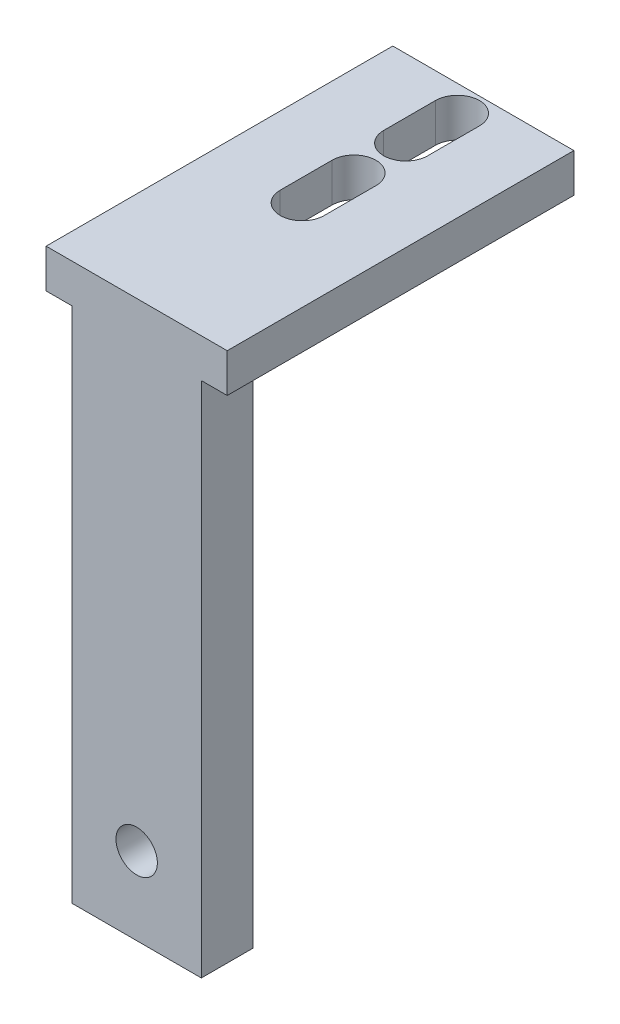
ISO-10303-21;
HEADER;
FILE_DESCRIPTION(('STEP AP214'),'2;1');
FILE_NAME('part.step','',(''),(''),'','','');
FILE_SCHEMA(('AUTOMOTIVE_DESIGN { 1 0 10303 214 1 1 1 1 }'));
ENDSEC;
DATA;
#1=APPLICATION_CONTEXT('core data for automotive mechanical design processes');
#2=APPLICATION_PROTOCOL_DEFINITION('international standard','automotive_design',2000,#1);
#3=PRODUCT_CONTEXT('',#1,'mechanical');
#4=PRODUCT('Part','Part','',(#3));
#5=PRODUCT_RELATED_PRODUCT_CATEGORY('part','',(#4));
#6=PRODUCT_DEFINITION_FORMATION('','',#4);
#7=PRODUCT_DEFINITION_CONTEXT('part definition',#1,'design');
#8=PRODUCT_DEFINITION('design','',#6,#7);
#9=PRODUCT_DEFINITION_SHAPE('','',#8);
#10=(LENGTH_UNIT() NAMED_UNIT(*) SI_UNIT(.MILLI.,.METRE.));
#11=(NAMED_UNIT(*) PLANE_ANGLE_UNIT() SI_UNIT($,.RADIAN.));
#12=(NAMED_UNIT(*) SI_UNIT($,.STERADIAN.) SOLID_ANGLE_UNIT());
#13=UNCERTAINTY_MEASURE_WITH_UNIT(LENGTH_MEASURE(1.E-05),#10,'distance_accuracy_value','');
#14=(GEOMETRIC_REPRESENTATION_CONTEXT(3) GLOBAL_UNCERTAINTY_ASSIGNED_CONTEXT((#13)) GLOBAL_UNIT_ASSIGNED_CONTEXT((#10,
#11,#12)) REPRESENTATION_CONTEXT('',''));
#15=CARTESIAN_POINT('',(0.,0.,0.));
#16=DIRECTION('',(0.,0.,1.));
#17=DIRECTION('',(1.,0.,0.));
#18=AXIS2_PLACEMENT_3D('',#15,#16,#17);
#19=CARTESIAN_POINT('',(0.,40.,47.8));
#20=DIRECTION('',(0.,0.,1.));
#21=DIRECTION('',(1.,0.,0.));
#22=AXIS2_PLACEMENT_3D('',#19,#20,#21);
#23=CYLINDRICAL_SURFACE('',#22,1.6);
#24=CARTESIAN_POINT('',(0.,40.,57.8));
#25=DIRECTION('',(0.,0.,1.));
#26=DIRECTION('',(1.,0.,0.));
#27=AXIS2_PLACEMENT_3D('',#24,#25,#26);
#28=CIRCLE('',#27,1.6);
#29=CARTESIAN_POINT('',(1.6,40.,57.8));
#30=VERTEX_POINT('',#29);
#31=EDGE_CURVE('E218',#30,#30,#28,.T.);
#32=ORIENTED_EDGE('',*,*,#31,.T.);
#33=EDGE_LOOP('',(#32));
#34=FACE_BOUND('',#33,.T.);
#35=CARTESIAN_POINT('',(0.,40.,53.8));
#36=DIRECTION('',(0.,0.,1.));
#37=DIRECTION('',(1.,0.,0.));
#38=AXIS2_PLACEMENT_3D('',#35,#36,#37);
#39=CIRCLE('',#38,1.6);
#40=CARTESIAN_POINT('',(1.6,40.,53.8));
#41=VERTEX_POINT('',#40);
#42=EDGE_CURVE('E334',#41,#41,#39,.T.);
#43=ORIENTED_EDGE('',*,*,#42,.F.);
#44=EDGE_LOOP('',(#43));
#45=FACE_BOUND('',#44,.T.);
#46=ADVANCED_FACE('F17',(#34,#45),#23,.F.);
#47=CARTESIAN_POINT('',(-5.,34.,53.8));
#48=DIRECTION('',(0.,1.,0.));
#49=DIRECTION('',(1.,0.,0.));
#50=AXIS2_PLACEMENT_3D('',#47,#48,#49);
#51=PLANE('',#50);
#52=DIRECTION('',(0.,0.,1.));
#53=VECTOR('',#52,1.);
#54=CARTESIAN_POINT('',(5.,34.,53.8));
#55=LINE('',#54,#53);
#56=CARTESIAN_POINT('',(5.,34.,53.8));
#57=VERTEX_POINT('',#56);
#58=CARTESIAN_POINT('',(5.,34.,57.8));
#59=VERTEX_POINT('',#58);
#60=EDGE_CURVE('E224',#57,#59,#55,.T.);
#61=ORIENTED_EDGE('',*,*,#60,.T.);
#62=DIRECTION('',(1.,0.,0.));
#63=VECTOR('',#62,1.);
#64=CARTESIAN_POINT('',(-5.,34.,57.8));
#65=LINE('',#64,#63);
#66=CARTESIAN_POINT('',(-5.,34.,57.8));
#67=VERTEX_POINT('',#66);
#68=EDGE_CURVE('E227',#67,#59,#65,.T.);
#69=ORIENTED_EDGE('',*,*,#68,.F.);
#70=DIRECTION('',(0.,0.,1.));
#71=VECTOR('',#70,1.);
#72=CARTESIAN_POINT('',(-5.,34.,53.8));
#73=LINE('',#72,#71);
#74=CARTESIAN_POINT('',(-5.,34.,53.8));
#75=VERTEX_POINT('',#74);
#76=EDGE_CURVE('E37',#75,#67,#73,.T.);
#77=ORIENTED_EDGE('',*,*,#76,.F.);
#78=DIRECTION('',(1.,0.,0.));
#79=VECTOR('',#78,1.);
#80=CARTESIAN_POINT('',(-5.,34.,53.8));
#81=LINE('',#80,#79);
#82=EDGE_CURVE('E44',#75,#57,#81,.T.);
#83=ORIENTED_EDGE('',*,*,#82,.T.);
#84=EDGE_LOOP('',(#61,#69,#77,#83));
#85=FACE_BOUND('',#84,.T.);
#86=ADVANCED_FACE('F391',(#85),#51,.F.);
#87=CARTESIAN_POINT('',(1.7,71.5,41.));
#88=DIRECTION('',(1.,0.,0.));
#89=DIRECTION('',(0.,1.,0.));
#90=AXIS2_PLACEMENT_3D('',#87,#88,#89);
#91=PLANE('',#90);
#92=DIRECTION('',(0.,-1.,0.));
#93=VECTOR('',#92,1.);
#94=CARTESIAN_POINT('',(1.7,79.5,45.));
#95=LINE('',#94,#93);
#96=CARTESIAN_POINT('',(1.7,77.,45.));
#97=VERTEX_POINT('',#96);
#98=CARTESIAN_POINT('',(1.7,74.,45.));
#99=VERTEX_POINT('',#98);
#100=EDGE_CURVE('E11',#97,#99,#95,.T.);
#101=ORIENTED_EDGE('',*,*,#100,.F.);
#102=DIRECTION('',(0.,0.,-1.));
#103=VECTOR('',#102,1.);
#104=CARTESIAN_POINT('',(1.7,77.,36.));
#105=LINE('',#104,#103);
#106=CARTESIAN_POINT('',(1.7,77.,41.));
#107=VERTEX_POINT('',#106);
#108=EDGE_CURVE('E288',#97,#107,#105,.T.);
#109=ORIENTED_EDGE('',*,*,#108,.T.);
#110=DIRECTION('',(0.,-1.,0.));
#111=VECTOR('',#110,1.);
#112=CARTESIAN_POINT('',(1.7,79.5,41.));
#113=LINE('',#112,#111);
#114=CARTESIAN_POINT('',(1.7,74.,41.));
#115=VERTEX_POINT('',#114);
#116=EDGE_CURVE('E254',#107,#115,#113,.T.);
#117=ORIENTED_EDGE('',*,*,#116,.T.);
#118=DIRECTION('',(0.,0.,-1.));
#119=VECTOR('',#118,1.);
#120=CARTESIAN_POINT('',(1.7,74.,36.));
#121=LINE('',#120,#119);
#122=EDGE_CURVE('E278',#99,#115,#121,.T.);
#123=ORIENTED_EDGE('',*,*,#122,.F.);
#124=EDGE_LOOP('',(#101,#109,#117,#123));
#125=FACE_BOUND('',#124,.T.);
#126=ADVANCED_FACE('F369',(#125),#91,.F.);
#127=CARTESIAN_POINT('',(0.,79.5,45.));
#128=DIRECTION('',(0.,-1.,0.));
#129=DIRECTION('',(1.,0.,0.));
#130=AXIS2_PLACEMENT_3D('',#127,#128,#129);
#131=CYLINDRICAL_SURFACE('',#130,1.7);
#132=DIRECTION('',(0.,1.,0.));
#133=VECTOR('',#132,1.);
#134=CARTESIAN_POINT('',(-1.7,71.5,45.));
#135=LINE('',#134,#133);
#136=CARTESIAN_POINT('',(-1.7,74.,45.));
#137=VERTEX_POINT('',#136);
#138=CARTESIAN_POINT('',(-1.7,77.,45.));
#139=VERTEX_POINT('',#138);
#140=EDGE_CURVE('E25',#137,#139,#135,.T.);
#141=ORIENTED_EDGE('',*,*,#140,.T.);
#142=CARTESIAN_POINT('',(0.,77.,45.));
#143=DIRECTION('',(0.,-1.,0.));
#144=DIRECTION('',(1.,0.,0.));
#145=AXIS2_PLACEMENT_3D('',#142,#143,#144);
#146=CIRCLE('',#145,1.7);
#147=EDGE_CURVE('E292',#97,#139,#146,.T.);
#148=ORIENTED_EDGE('',*,*,#147,.F.);
#149=ORIENTED_EDGE('',*,*,#100,.T.);
#150=CARTESIAN_POINT('',(0.,74.,45.));
#151=DIRECTION('',(0.,-1.,0.));
#152=DIRECTION('',(1.,0.,0.));
#153=AXIS2_PLACEMENT_3D('',#150,#151,#152);
#154=CIRCLE('',#153,1.7);
#155=EDGE_CURVE('E274',#99,#137,#154,.T.);
#156=ORIENTED_EDGE('',*,*,#155,.T.);
#157=EDGE_LOOP('',(#141,#148,#149,#156));
#158=FACE_BOUND('',#157,.T.);
#159=ADVANCED_FACE('F358',(#158),#131,.F.);
#160=CARTESIAN_POINT('',(-1.7,71.5,41.));
#161=DIRECTION('',(1.,0.,0.));
#162=DIRECTION('',(0.,1.,0.));
#163=AXIS2_PLACEMENT_3D('',#160,#161,#162);
#164=PLANE('',#163);
#165=ORIENTED_EDGE('',*,*,#140,.F.);
#166=DIRECTION('',(0.,0.,-1.));
#167=VECTOR('',#166,1.);
#168=CARTESIAN_POINT('',(-1.7,74.,36.));
#169=LINE('',#168,#167);
#170=CARTESIAN_POINT('',(-1.7,74.,41.));
#171=VERTEX_POINT('',#170);
#172=EDGE_CURVE('E264',#137,#171,#169,.T.);
#173=ORIENTED_EDGE('',*,*,#172,.T.);
#174=DIRECTION('',(0.,1.,0.));
#175=VECTOR('',#174,1.);
#176=CARTESIAN_POINT('',(-1.7,71.5,41.));
#177=LINE('',#176,#175);
#178=CARTESIAN_POINT('',(-1.7,77.,41.));
#179=VERTEX_POINT('',#178);
#180=EDGE_CURVE('E257',#171,#179,#177,.T.);
#181=ORIENTED_EDGE('',*,*,#180,.T.);
#182=DIRECTION('',(0.,0.,-1.));
#183=VECTOR('',#182,1.);
#184=CARTESIAN_POINT('',(-1.7,77.,36.));
#185=LINE('',#184,#183);
#186=EDGE_CURVE('E320',#139,#179,#185,.T.);
#187=ORIENTED_EDGE('',*,*,#186,.F.);
#188=EDGE_LOOP('',(#165,#173,#181,#187));
#189=FACE_BOUND('',#188,.T.);
#190=ADVANCED_FACE('F363',(#189),#164,.T.);
#191=CARTESIAN_POINT('',(0.,79.5,41.));
#192=DIRECTION('',(0.,-1.,0.));
#193=DIRECTION('',(1.,0.,0.));
#194=AXIS2_PLACEMENT_3D('',#191,#192,#193);
#195=CYLINDRICAL_SURFACE('',#194,1.7);
#196=CARTESIAN_POINT('',(0.,77.,41.));
#197=DIRECTION('',(0.,-1.,0.));
#198=DIRECTION('',(1.,0.,0.));
#199=AXIS2_PLACEMENT_3D('',#196,#197,#198);
#200=CIRCLE('',#199,1.7);
#201=EDGE_CURVE('E293',#179,#107,#200,.T.);
#202=ORIENTED_EDGE('',*,*,#201,.F.);
#203=ORIENTED_EDGE('',*,*,#180,.F.);
#204=CARTESIAN_POINT('',(0.,74.,41.));
#205=DIRECTION('',(0.,-1.,0.));
#206=DIRECTION('',(1.,0.,0.));
#207=AXIS2_PLACEMENT_3D('',#204,#205,#206);
#208=CIRCLE('',#207,1.7);
#209=EDGE_CURVE('E228',#171,#115,#208,.T.);
#210=ORIENTED_EDGE('',*,*,#209,.T.);
#211=ORIENTED_EDGE('',*,*,#116,.F.);
#212=EDGE_LOOP('',(#202,#203,#210,#211));
#213=FACE_BOUND('',#212,.T.);
#214=ADVANCED_FACE('F375',(#213),#195,.F.);
#215=CARTESIAN_POINT('',(1.7,71.5,33.));
#216=DIRECTION('',(1.,0.,0.));
#217=DIRECTION('',(0.,1.,0.));
#218=AXIS2_PLACEMENT_3D('',#215,#216,#217);
#219=PLANE('',#218);
#220=DIRECTION('',(0.,-1.,0.));
#221=VECTOR('',#220,1.);
#222=CARTESIAN_POINT('',(1.7,79.5,37.));
#223=LINE('',#222,#221);
#224=CARTESIAN_POINT('',(1.7,77.,37.));
#225=VERTEX_POINT('',#224);
#226=CARTESIAN_POINT('',(1.7,74.,37.));
#227=VERTEX_POINT('',#226);
#228=EDGE_CURVE('E349',#225,#227,#223,.T.);
#229=ORIENTED_EDGE('',*,*,#228,.F.);
#230=DIRECTION('',(0.,0.,-1.));
#231=VECTOR('',#230,1.);
#232=CARTESIAN_POINT('',(1.7,77.,32.));
#233=LINE('',#232,#231);
#234=CARTESIAN_POINT('',(1.7,77.,33.));
#235=VERTEX_POINT('',#234);
#236=EDGE_CURVE('E265',#225,#235,#233,.T.);
#237=ORIENTED_EDGE('',*,*,#236,.T.);
#238=DIRECTION('',(0.,-1.,0.));
#239=VECTOR('',#238,1.);
#240=CARTESIAN_POINT('',(1.7,79.5,33.));
#241=LINE('',#240,#239);
#242=CARTESIAN_POINT('',(1.7,74.,33.));
#243=VERTEX_POINT('',#242);
#244=EDGE_CURVE('E343',#235,#243,#241,.T.);
#245=ORIENTED_EDGE('',*,*,#244,.T.);
#246=DIRECTION('',(0.,0.,-1.));
#247=VECTOR('',#246,1.);
#248=CARTESIAN_POINT('',(1.7,74.,32.));
#249=LINE('',#248,#247);
#250=EDGE_CURVE('E205',#227,#243,#249,.T.);
#251=ORIENTED_EDGE('',*,*,#250,.F.);
#252=EDGE_LOOP('',(#229,#237,#245,#251));
#253=FACE_BOUND('',#252,.T.);
#254=ADVANCED_FACE('F377',(#253),#219,.F.);
#255=CARTESIAN_POINT('',(0.,79.5,37.));
#256=DIRECTION('',(0.,-1.,0.));
#257=DIRECTION('',(1.,0.,0.));
#258=AXIS2_PLACEMENT_3D('',#255,#256,#257);
#259=CYLINDRICAL_SURFACE('',#258,1.7);
#260=DIRECTION('',(0.,1.,0.));
#261=VECTOR('',#260,1.);
#262=CARTESIAN_POINT('',(-1.7,71.5,37.));
#263=LINE('',#262,#261);
#264=CARTESIAN_POINT('',(-1.7,74.,37.));
#265=VERTEX_POINT('',#264);
#266=CARTESIAN_POINT('',(-1.7,77.,37.));
#267=VERTEX_POINT('',#266);
#268=EDGE_CURVE('E346',#265,#267,#263,.T.);
#269=ORIENTED_EDGE('',*,*,#268,.T.);
#270=CARTESIAN_POINT('',(0.,77.,37.));
#271=DIRECTION('',(0.,-1.,0.));
#272=DIRECTION('',(1.,0.,0.));
#273=AXIS2_PLACEMENT_3D('',#270,#271,#272);
#274=CIRCLE('',#273,1.7);
#275=EDGE_CURVE('E269',#225,#267,#274,.T.);
#276=ORIENTED_EDGE('',*,*,#275,.F.);
#277=ORIENTED_EDGE('',*,*,#228,.T.);
#278=CARTESIAN_POINT('',(0.,74.,37.));
#279=DIRECTION('',(0.,-1.,0.));
#280=DIRECTION('',(1.,0.,0.));
#281=AXIS2_PLACEMENT_3D('',#278,#279,#280);
#282=CIRCLE('',#281,1.7);
#283=EDGE_CURVE('E210',#227,#265,#282,.T.);
#284=ORIENTED_EDGE('',*,*,#283,.T.);
#285=EDGE_LOOP('',(#269,#276,#277,#284));
#286=FACE_BOUND('',#285,.T.);
#287=ADVANCED_FACE('F384',(#286),#259,.F.);
#288=CARTESIAN_POINT('',(-1.7,71.5,33.));
#289=DIRECTION('',(1.,0.,0.));
#290=DIRECTION('',(0.,1.,0.));
#291=AXIS2_PLACEMENT_3D('',#288,#289,#290);
#292=PLANE('',#291);
#293=ORIENTED_EDGE('',*,*,#268,.F.);
#294=DIRECTION('',(0.,0.,-1.));
#295=VECTOR('',#294,1.);
#296=CARTESIAN_POINT('',(-1.7,74.,32.));
#297=LINE('',#296,#295);
#298=CARTESIAN_POINT('',(-1.7,74.,33.));
#299=VERTEX_POINT('',#298);
#300=EDGE_CURVE('E230',#265,#299,#297,.T.);
#301=ORIENTED_EDGE('',*,*,#300,.T.);
#302=DIRECTION('',(0.,1.,0.));
#303=VECTOR('',#302,1.);
#304=CARTESIAN_POINT('',(-1.7,71.5,33.));
#305=LINE('',#304,#303);
#306=CARTESIAN_POINT('',(-1.7,77.,33.));
#307=VERTEX_POINT('',#306);
#308=EDGE_CURVE('E340',#299,#307,#305,.T.);
#309=ORIENTED_EDGE('',*,*,#308,.T.);
#310=DIRECTION('',(0.,0.,-1.));
#311=VECTOR('',#310,1.);
#312=CARTESIAN_POINT('',(-1.7,77.,32.));
#313=LINE('',#312,#311);
#314=EDGE_CURVE('E310',#267,#307,#313,.T.);
#315=ORIENTED_EDGE('',*,*,#314,.F.);
#316=EDGE_LOOP('',(#293,#301,#309,#315));
#317=FACE_BOUND('',#316,.T.);
#318=ADVANCED_FACE('F416',(#317),#292,.T.);
#319=CARTESIAN_POINT('',(0.,79.5,33.));
#320=DIRECTION('',(0.,-1.,0.));
#321=DIRECTION('',(1.,0.,0.));
#322=AXIS2_PLACEMENT_3D('',#319,#320,#321);
#323=CYLINDRICAL_SURFACE('',#322,1.7);
#324=CARTESIAN_POINT('',(0.,77.,33.));
#325=DIRECTION('',(0.,-1.,0.));
#326=DIRECTION('',(1.,0.,0.));
#327=AXIS2_PLACEMENT_3D('',#324,#325,#326);
#328=CIRCLE('',#327,1.7);
#329=EDGE_CURVE('E270',#307,#235,#328,.T.);
#330=ORIENTED_EDGE('',*,*,#329,.F.);
#331=ORIENTED_EDGE('',*,*,#308,.F.);
#332=CARTESIAN_POINT('',(0.,74.,33.));
#333=DIRECTION('',(0.,-1.,0.));
#334=DIRECTION('',(1.,0.,0.));
#335=AXIS2_PLACEMENT_3D('',#332,#333,#334);
#336=CIRCLE('',#335,1.7);
#337=EDGE_CURVE('E209',#299,#243,#336,.T.);
#338=ORIENTED_EDGE('',*,*,#337,.T.);
#339=ORIENTED_EDGE('',*,*,#244,.F.);
#340=EDGE_LOOP('',(#330,#331,#338,#339));
#341=FACE_BOUND('',#340,.T.);
#342=ADVANCED_FACE('F412',(#341),#323,.F.);
#343=CARTESIAN_POINT('',(-5.,34.,53.8));
#344=DIRECTION('',(1.,0.,0.));
#345=DIRECTION('',(0.,1.,0.));
#346=AXIS2_PLACEMENT_3D('',#343,#344,#345);
#347=PLANE('',#346);
#348=DIRECTION('',(0.,0.,-1.));
#349=VECTOR('',#348,1.);
#350=CARTESIAN_POINT('',(-5.,74.,42.4));
#351=LINE('',#350,#349);
#352=CARTESIAN_POINT('',(-5.,74.,57.8));
#353=VERTEX_POINT('',#352);
#354=CARTESIAN_POINT('',(-5.,74.,53.8));
#355=VERTEX_POINT('',#354);
#356=EDGE_CURVE('E176',#353,#355,#351,.T.);
#357=ORIENTED_EDGE('',*,*,#356,.T.);
#358=DIRECTION('',(0.,1.,0.));
#359=VECTOR('',#358,1.);
#360=CARTESIAN_POINT('',(-5.,34.,53.8));
#361=LINE('',#360,#359);
#362=EDGE_CURVE('E331',#75,#355,#361,.T.);
#363=ORIENTED_EDGE('',*,*,#362,.F.);
#364=ORIENTED_EDGE('',*,*,#76,.T.);
#365=DIRECTION('',(0.,1.,0.));
#366=VECTOR('',#365,1.);
#367=CARTESIAN_POINT('',(-5.,34.,57.8));
#368=LINE('',#367,#366);
#369=EDGE_CURVE('E225',#67,#353,#368,.T.);
#370=ORIENTED_EDGE('',*,*,#369,.T.);
#371=EDGE_LOOP('',(#357,#363,#364,#370));
#372=FACE_BOUND('',#371,.T.);
#373=ADVANCED_FACE('F404',(#372),#347,.F.);
#374=CARTESIAN_POINT('',(-5.,34.,53.8));
#375=DIRECTION('',(0.,0.,1.));
#376=DIRECTION('',(1.,0.,0.));
#377=AXIS2_PLACEMENT_3D('',#374,#375,#376);
#378=PLANE('',#377);
#379=ORIENTED_EDGE('',*,*,#42,.T.);
#380=EDGE_LOOP('',(#379));
#381=FACE_BOUND('',#380,.T.);
#382=DIRECTION('',(1.,0.,0.));
#383=VECTOR('',#382,1.);
#384=CARTESIAN_POINT('',(-6.,74.,53.8));
#385=LINE('',#384,#383);
#386=CARTESIAN_POINT('',(5.,74.,53.8));
#387=VERTEX_POINT('',#386);
#388=EDGE_CURVE('E241',#355,#387,#385,.T.);
#389=ORIENTED_EDGE('',*,*,#388,.T.);
#390=DIRECTION('',(0.,1.,0.));
#391=VECTOR('',#390,1.);
#392=CARTESIAN_POINT('',(5.,34.,53.8));
#393=LINE('',#392,#391);
#394=EDGE_CURVE('E221',#57,#387,#393,.T.);
#395=ORIENTED_EDGE('',*,*,#394,.F.);
#396=ORIENTED_EDGE('',*,*,#82,.F.);
#397=ORIENTED_EDGE('',*,*,#362,.T.);
#398=EDGE_LOOP('',(#389,#395,#396,#397));
#399=FACE_BOUND('',#398,.T.);
#400=ADVANCED_FACE('F400',(#381,#399),#378,.F.);
#401=CARTESIAN_POINT('',(5.,34.,53.8));
#402=DIRECTION('',(1.,0.,0.));
#403=DIRECTION('',(0.,1.,0.));
#404=AXIS2_PLACEMENT_3D('',#401,#402,#403);
#405=PLANE('',#404);
#406=DIRECTION('',(0.,1.,0.));
#407=VECTOR('',#406,1.);
#408=CARTESIAN_POINT('',(5.,34.,57.8));
#409=LINE('',#408,#407);
#410=CARTESIAN_POINT('',(5.,74.,57.8));
#411=VERTEX_POINT('',#410);
#412=EDGE_CURVE('E245',#59,#411,#409,.T.);
#413=ORIENTED_EDGE('',*,*,#412,.F.);
#414=ORIENTED_EDGE('',*,*,#60,.F.);
#415=ORIENTED_EDGE('',*,*,#394,.T.);
#416=DIRECTION('',(0.,0.,-1.));
#417=VECTOR('',#416,1.);
#418=CARTESIAN_POINT('',(5.,74.,42.4));
#419=LINE('',#418,#417);
#420=EDGE_CURVE('E237',#411,#387,#419,.T.);
#421=ORIENTED_EDGE('',*,*,#420,.F.);
#422=EDGE_LOOP('',(#413,#414,#415,#421));
#423=FACE_BOUND('',#422,.T.);
#424=ADVANCED_FACE('F403',(#423),#405,.T.);
#425=CARTESIAN_POINT('',(7.,74.,31.));
#426=DIRECTION('',(1.,0.,0.));
#427=DIRECTION('',(0.,1.,0.));
#428=AXIS2_PLACEMENT_3D('',#425,#426,#427);
#429=PLANE('',#428);
#430=DIRECTION('',(0.,0.,1.));
#431=VECTOR('',#430,1.);
#432=CARTESIAN_POINT('',(7.,74.,31.));
#433=LINE('',#432,#431);
#434=CARTESIAN_POINT('',(7.,74.,31.));
#435=VERTEX_POINT('',#434);
#436=CARTESIAN_POINT('',(7.,74.,57.8));
#437=VERTEX_POINT('',#436);
#438=EDGE_CURVE('E213',#435,#437,#433,.T.);
#439=ORIENTED_EDGE('',*,*,#438,.F.);
#440=DIRECTION('',(0.,1.,0.));
#441=VECTOR('',#440,1.);
#442=CARTESIAN_POINT('',(7.,74.,31.));
#443=LINE('',#442,#441);
#444=CARTESIAN_POINT('',(7.,77.,31.));
#445=VERTEX_POINT('',#444);
#446=EDGE_CURVE('E324',#435,#445,#443,.T.);
#447=ORIENTED_EDGE('',*,*,#446,.T.);
#448=DIRECTION('',(0.,0.,1.));
#449=VECTOR('',#448,1.);
#450=CARTESIAN_POINT('',(7.,77.,31.));
#451=LINE('',#450,#449);
#452=CARTESIAN_POINT('',(7.,77.,57.8));
#453=VERTEX_POINT('',#452);
#454=EDGE_CURVE('E214',#445,#453,#451,.T.);
#455=ORIENTED_EDGE('',*,*,#454,.T.);
#456=DIRECTION('',(0.,1.,0.));
#457=VECTOR('',#456,1.);
#458=CARTESIAN_POINT('',(7.,74.,57.8));
#459=LINE('',#458,#457);
#460=EDGE_CURVE('E242',#437,#453,#459,.T.);
#461=ORIENTED_EDGE('',*,*,#460,.F.);
#462=EDGE_LOOP('',(#439,#447,#455,#461));
#463=FACE_BOUND('',#462,.T.);
#464=ADVANCED_FACE('F419',(#463),#429,.T.);
#465=CARTESIAN_POINT('',(-7.,74.,31.));
#466=DIRECTION('',(0.,0.,1.));
#467=DIRECTION('',(1.,0.,0.));
#468=AXIS2_PLACEMENT_3D('',#465,#466,#467);
#469=PLANE('',#468);
#470=DIRECTION('',(1.,0.,0.));
#471=VECTOR('',#470,1.);
#472=CARTESIAN_POINT('',(-7.,77.,31.));
#473=LINE('',#472,#471);
#474=CARTESIAN_POINT('',(-7.,77.,31.));
#475=VERTEX_POINT('',#474);
#476=EDGE_CURVE('E217',#475,#445,#473,.T.);
#477=ORIENTED_EDGE('',*,*,#476,.T.);
#478=ORIENTED_EDGE('',*,*,#446,.F.);
#479=DIRECTION('',(1.,0.,0.));
#480=VECTOR('',#479,1.);
#481=CARTESIAN_POINT('',(-7.,74.,31.));
#482=LINE('',#481,#480);
#483=CARTESIAN_POINT('',(-7.,74.,31.));
#484=VERTEX_POINT('',#483);
#485=EDGE_CURVE('E181',#484,#435,#482,.T.);
#486=ORIENTED_EDGE('',*,*,#485,.F.);
#487=DIRECTION('',(0.,1.,0.));
#488=VECTOR('',#487,1.);
#489=CARTESIAN_POINT('',(-7.,74.,31.));
#490=LINE('',#489,#488);
#491=EDGE_CURVE('E189',#484,#475,#490,.T.);
#492=ORIENTED_EDGE('',*,*,#491,.T.);
#493=EDGE_LOOP('',(#477,#478,#486,#492));
#494=FACE_BOUND('',#493,.T.);
#495=ADVANCED_FACE('F422',(#494),#469,.F.);
#496=CARTESIAN_POINT('',(-7.,77.,31.));
#497=DIRECTION('',(0.,1.,0.));
#498=DIRECTION('',(1.,0.,0.));
#499=AXIS2_PLACEMENT_3D('',#496,#497,#498);
#500=PLANE('',#499);
#501=ORIENTED_EDGE('',*,*,#201,.T.);
#502=ORIENTED_EDGE('',*,*,#108,.F.);
#503=ORIENTED_EDGE('',*,*,#147,.T.);
#504=ORIENTED_EDGE('',*,*,#186,.T.);
#505=EDGE_LOOP('',(#501,#502,#503,#504));
#506=FACE_BOUND('',#505,.T.);
#507=ORIENTED_EDGE('',*,*,#329,.T.);
#508=ORIENTED_EDGE('',*,*,#236,.F.);
#509=ORIENTED_EDGE('',*,*,#275,.T.);
#510=ORIENTED_EDGE('',*,*,#314,.T.);
#511=EDGE_LOOP('',(#507,#508,#509,#510));
#512=FACE_BOUND('',#511,.T.);
#513=ORIENTED_EDGE('',*,*,#454,.F.);
#514=ORIENTED_EDGE('',*,*,#476,.F.);
#515=DIRECTION('',(0.,0.,1.));
#516=VECTOR('',#515,1.);
#517=CARTESIAN_POINT('',(-7.,77.,31.));
#518=LINE('',#517,#516);
#519=CARTESIAN_POINT('',(-7.,77.,57.8));
#520=VERTEX_POINT('',#519);
#521=EDGE_CURVE('E199',#475,#520,#518,.T.);
#522=ORIENTED_EDGE('',*,*,#521,.T.);
#523=DIRECTION('',(-1.,0.,0.));
#524=VECTOR('',#523,1.);
#525=CARTESIAN_POINT('',(7.,77.,57.8));
#526=LINE('',#525,#524);
#527=EDGE_CURVE('E196',#453,#520,#526,.T.);
#528=ORIENTED_EDGE('',*,*,#527,.F.);
#529=EDGE_LOOP('',(#513,#514,#522,#528));
#530=FACE_BOUND('',#529,.T.);
#531=ADVANCED_FACE('F366',(#506,#512,#530),#500,.T.);
#532=CARTESIAN_POINT('',(-7.,74.,57.8));
#533=DIRECTION('',(0.,0.,1.));
#534=DIRECTION('',(1.,0.,0.));
#535=AXIS2_PLACEMENT_3D('',#532,#533,#534);
#536=PLANE('',#535);
#537=ORIENTED_EDGE('',*,*,#31,.F.);
#538=EDGE_LOOP('',(#537));
#539=FACE_BOUND('',#538,.T.);
#540=DIRECTION('',(0.,1.,0.));
#541=VECTOR('',#540,1.);
#542=CARTESIAN_POINT('',(-7.,74.,57.8));
#543=LINE('',#542,#541);
#544=CARTESIAN_POINT('',(-7.,74.,57.8));
#545=VERTEX_POINT('',#544);
#546=EDGE_CURVE('E187',#545,#520,#543,.T.);
#547=ORIENTED_EDGE('',*,*,#546,.F.);
#548=DIRECTION('',(1.,0.,0.));
#549=VECTOR('',#548,1.);
#550=CARTESIAN_POINT('',(-7.,74.,57.8));
#551=LINE('',#550,#549);
#552=EDGE_CURVE('E167',#545,#353,#551,.T.);
#553=ORIENTED_EDGE('',*,*,#552,.T.);
#554=ORIENTED_EDGE('',*,*,#369,.F.);
#555=ORIENTED_EDGE('',*,*,#68,.T.);
#556=ORIENTED_EDGE('',*,*,#412,.T.);
#557=DIRECTION('',(1.,0.,0.));
#558=VECTOR('',#557,1.);
#559=CARTESIAN_POINT('',(-7.,74.,57.8));
#560=LINE('',#559,#558);
#561=EDGE_CURVE('E191',#411,#437,#560,.T.);
#562=ORIENTED_EDGE('',*,*,#561,.T.);
#563=ORIENTED_EDGE('',*,*,#460,.T.);
#564=ORIENTED_EDGE('',*,*,#527,.T.);
#565=EDGE_LOOP('',(#547,#553,#554,#555,#556,#562,#563,#564));
#566=FACE_BOUND('',#565,.T.);
#567=ADVANCED_FACE('F193',(#539,#566),#536,.T.);
#568=CARTESIAN_POINT('',(-7.,74.,31.));
#569=DIRECTION('',(0.,1.,0.));
#570=DIRECTION('',(1.,0.,0.));
#571=AXIS2_PLACEMENT_3D('',#568,#569,#570);
#572=PLANE('',#571);
#573=ORIENTED_EDGE('',*,*,#172,.F.);
#574=ORIENTED_EDGE('',*,*,#155,.F.);
#575=ORIENTED_EDGE('',*,*,#122,.T.);
#576=ORIENTED_EDGE('',*,*,#209,.F.);
#577=EDGE_LOOP('',(#573,#574,#575,#576));
#578=FACE_BOUND('',#577,.T.);
#579=ORIENTED_EDGE('',*,*,#300,.F.);
#580=ORIENTED_EDGE('',*,*,#283,.F.);
#581=ORIENTED_EDGE('',*,*,#250,.T.);
#582=ORIENTED_EDGE('',*,*,#337,.F.);
#583=EDGE_LOOP('',(#579,#580,#581,#582));
#584=FACE_BOUND('',#583,.T.);
#585=ORIENTED_EDGE('',*,*,#561,.F.);
#586=ORIENTED_EDGE('',*,*,#420,.T.);
#587=ORIENTED_EDGE('',*,*,#388,.F.);
#588=ORIENTED_EDGE('',*,*,#356,.F.);
#589=ORIENTED_EDGE('',*,*,#552,.F.);
#590=DIRECTION('',(0.,0.,1.));
#591=VECTOR('',#590,1.);
#592=CARTESIAN_POINT('',(-7.,74.,31.));
#593=LINE('',#592,#591);
#594=EDGE_CURVE('E172',#484,#545,#593,.T.);
#595=ORIENTED_EDGE('',*,*,#594,.F.);
#596=ORIENTED_EDGE('',*,*,#485,.T.);
#597=ORIENTED_EDGE('',*,*,#438,.T.);
#598=EDGE_LOOP('',(#585,#586,#587,#588,#589,#595,#596,#597));
#599=FACE_BOUND('',#598,.T.);
#600=ADVANCED_FACE('F170',(#578,#584,#599),#572,.F.);
#601=CARTESIAN_POINT('',(-7.,74.,31.));
#602=DIRECTION('',(1.,0.,0.));
#603=DIRECTION('',(0.,1.,0.));
#604=AXIS2_PLACEMENT_3D('',#601,#602,#603);
#605=PLANE('',#604);
#606=ORIENTED_EDGE('',*,*,#546,.T.);
#607=ORIENTED_EDGE('',*,*,#521,.F.);
#608=ORIENTED_EDGE('',*,*,#491,.F.);
#609=ORIENTED_EDGE('',*,*,#594,.T.);
#610=EDGE_LOOP('',(#606,#607,#608,#609));
#611=FACE_BOUND('',#610,.T.);
#612=ADVANCED_FACE('F185',(#611),#605,.F.);
#613=CLOSED_SHELL('',(#46,#86,#126,#159,#190,#214,#254,#287,#318,#342,#373,#400,#424,#464,#495,
#531,#567,#600,#612));
#614=MANIFOLD_SOLID_BREP('B1',#613);
#615=ADVANCED_BREP_SHAPE_REPRESENTATION('',(#18,#614),#14);
#616=SHAPE_DEFINITION_REPRESENTATION(#9,#615);
ENDSEC;
END-ISO-10303-21;
